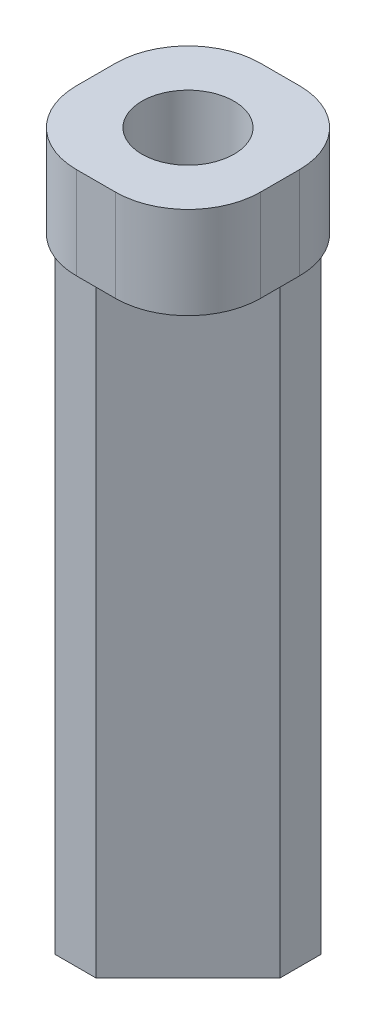
ISO-10303-21;
HEADER;
FILE_DESCRIPTION(('STEP AP214'),'2;1');
FILE_NAME('part.step','',(''),(''),'','','');
FILE_SCHEMA(('AUTOMOTIVE_DESIGN { 1 0 10303 214 1 1 1 1 }'));
ENDSEC;
DATA;
#1=APPLICATION_CONTEXT('core data for automotive mechanical design processes');
#2=APPLICATION_PROTOCOL_DEFINITION('international standard','automotive_design',2000,#1);
#3=PRODUCT_CONTEXT('',#1,'mechanical');
#4=PRODUCT('Part','Part','',(#3));
#5=PRODUCT_RELATED_PRODUCT_CATEGORY('part','',(#4));
#6=PRODUCT_DEFINITION_FORMATION('','',#4);
#7=PRODUCT_DEFINITION_CONTEXT('part definition',#1,'design');
#8=PRODUCT_DEFINITION('design','',#6,#7);
#9=PRODUCT_DEFINITION_SHAPE('','',#8);
#10=(LENGTH_UNIT() NAMED_UNIT(*) SI_UNIT(.MILLI.,.METRE.));
#11=(NAMED_UNIT(*) PLANE_ANGLE_UNIT() SI_UNIT($,.RADIAN.));
#12=(NAMED_UNIT(*) SI_UNIT($,.STERADIAN.) SOLID_ANGLE_UNIT());
#13=UNCERTAINTY_MEASURE_WITH_UNIT(LENGTH_MEASURE(1.E-05),#10,'distance_accuracy_value','');
#14=(GEOMETRIC_REPRESENTATION_CONTEXT(3) GLOBAL_UNCERTAINTY_ASSIGNED_CONTEXT((#13)) GLOBAL_UNIT_ASSIGNED_CONTEXT((#10,
#11,#12)) REPRESENTATION_CONTEXT('',''));
#15=CARTESIAN_POINT('',(0.,0.,0.));
#16=DIRECTION('',(0.,0.,1.));
#17=DIRECTION('',(1.,0.,0.));
#18=AXIS2_PLACEMENT_3D('',#15,#16,#17);
#19=CARTESIAN_POINT('',(44.45,19.05,57.15));
#20=DIRECTION('',(0.,1.,0.));
#21=DIRECTION('',(0.,0.,1.));
#22=AXIS2_PLACEMENT_3D('',#19,#20,#21);
#23=PLANE('',#22);
#24=CARTESIAN_POINT('',(-55.2794444968305,19.05,-55.2794444968305));
#25=DIRECTION('',(0.,-1.,0.));
#26=DIRECTION('',(0.,0.,-1.));
#27=AXIS2_PLACEMENT_3D('',#24,#25,#26);
#28=CIRCLE('',#27,3.81);
#29=CARTESIAN_POINT('',(-55.2794444968305,19.05,-59.0894444968305));
#30=VERTEX_POINT('',#29);
#31=EDGE_CURVE('E427',#30,#30,#28,.T.);
#32=ORIENTED_EDGE('',*,*,#31,.F.);
#33=EDGE_LOOP('',(#32));
#34=FACE_BOUND('',#33,.T.);
#35=CARTESIAN_POINT('',(-53.5,19.05,-48.1));
#36=DIRECTION('',(0.,-1.,0.));
#37=DIRECTION('',(0.,0.,-1.));
#38=AXIS2_PLACEMENT_3D('',#35,#36,#37);
#39=CIRCLE('',#38,10.);
#40=CARTESIAN_POINT('',(-62.8100751876664,19.05,-44.45));
#41=VERTEX_POINT('',#40);
#42=CARTESIAN_POINT('',(-63.5,19.05,-48.1));
#43=VERTEX_POINT('',#42);
#44=EDGE_CURVE('E242',#41,#43,#39,.T.);
#45=ORIENTED_EDGE('',*,*,#44,.T.);
#46=DIRECTION('',(0.,0.,1.));
#47=VECTOR('',#46,1.);
#48=CARTESIAN_POINT('',(-63.5,19.05,-63.5));
#49=LINE('',#48,#47);
#50=CARTESIAN_POINT('',(-63.5,19.05,-53.5));
#51=VERTEX_POINT('',#50);
#52=EDGE_CURVE('E50',#51,#43,#49,.T.);
#53=ORIENTED_EDGE('',*,*,#52,.F.);
#54=CARTESIAN_POINT('',(-53.5,19.05,-53.5));
#55=DIRECTION('',(0.,1.,0.));
#56=DIRECTION('',(0.,0.,1.));
#57=AXIS2_PLACEMENT_3D('',#54,#55,#56);
#58=CIRCLE('',#57,10.);
#59=CARTESIAN_POINT('',(-53.5,19.05,-63.5));
#60=VERTEX_POINT('',#59);
#61=EDGE_CURVE('E238',#51,#60,#58,.F.);
#62=ORIENTED_EDGE('',*,*,#61,.T.);
#63=DIRECTION('',(-1.,0.,0.));
#64=VECTOR('',#63,1.);
#65=CARTESIAN_POINT('',(63.5,19.05,-63.5));
#66=LINE('',#65,#64);
#67=CARTESIAN_POINT('',(-48.1,19.05,-63.5));
#68=VERTEX_POINT('',#67);
#69=EDGE_CURVE('E243',#68,#60,#66,.T.);
#70=ORIENTED_EDGE('',*,*,#69,.F.);
#71=CARTESIAN_POINT('',(-48.1,19.05,-53.5));
#72=DIRECTION('',(0.,-1.,0.));
#73=DIRECTION('',(0.,0.,-1.));
#74=AXIS2_PLACEMENT_3D('',#71,#72,#73);
#75=CIRCLE('',#74,10.);
#76=CARTESIAN_POINT('',(-44.45,19.05,-62.8100751876663));
#77=VERTEX_POINT('',#76);
#78=EDGE_CURVE('E70',#68,#77,#75,.T.);
#79=ORIENTED_EDGE('',*,*,#78,.T.);
#80=DIRECTION('',(0.,0.,1.));
#81=VECTOR('',#80,1.);
#82=CARTESIAN_POINT('',(-44.45,19.05,-63.5));
#83=LINE('',#82,#81);
#84=CARTESIAN_POINT('',(-44.45,19.05,-57.1500000000001));
#85=VERTEX_POINT('',#84);
#86=EDGE_CURVE('E11',#77,#85,#83,.T.);
#87=ORIENTED_EDGE('',*,*,#86,.T.);
#88=DIRECTION('',(-0.707106781186547,0.,0.707106781186548));
#89=VECTOR('',#88,1.);
#90=CARTESIAN_POINT('',(-41.275,19.05,-60.325));
#91=LINE('',#90,#89);
#92=CARTESIAN_POINT('',(-57.15,19.05,-44.45));
#93=VERTEX_POINT('',#92);
#94=EDGE_CURVE('E56',#85,#93,#91,.T.);
#95=ORIENTED_EDGE('',*,*,#94,.T.);
#96=DIRECTION('',(1.,0.,0.));
#97=VECTOR('',#96,1.);
#98=CARTESIAN_POINT('',(-63.5,19.05,-44.45));
#99=LINE('',#98,#97);
#100=EDGE_CURVE('E197',#41,#93,#99,.T.);
#101=ORIENTED_EDGE('',*,*,#100,.F.);
#102=EDGE_LOOP('',(#45,#53,#62,#70,#79,#87,#95,#101));
#103=FACE_BOUND('',#102,.T.);
#104=ADVANCED_FACE('F47',(#34,#103),#23,.F.);
#105=CARTESIAN_POINT('',(-50.8,120.65,-50.8));
#106=DIRECTION('',(0.,-1.,0.));
#107=DIRECTION('',(0.,0.,-1.));
#108=AXIS2_PLACEMENT_3D('',#105,#106,#107);
#109=CYLINDRICAL_SURFACE('',#108,6.35);
#110=CARTESIAN_POINT('',(-50.8,120.65,-50.8));
#111=DIRECTION('',(0.,1.,0.));
#112=DIRECTION('',(0.,0.,1.));
#113=AXIS2_PLACEMENT_3D('',#110,#111,#112);
#114=CIRCLE('',#113,6.35);
#115=CARTESIAN_POINT('',(-50.8,120.65,-44.45));
#116=VERTEX_POINT('',#115);
#117=EDGE_CURVE('E193',#116,#116,#114,.T.);
#118=ORIENTED_EDGE('',*,*,#117,.T.);
#119=EDGE_LOOP('',(#118));
#120=FACE_BOUND('',#119,.T.);
#121=CARTESIAN_POINT('',(-50.8,107.95,-50.8));
#122=DIRECTION('',(0.,1.,0.));
#123=DIRECTION('',(0.,0.,1.));
#124=AXIS2_PLACEMENT_3D('',#121,#122,#123);
#125=CIRCLE('',#124,6.35);
#126=CARTESIAN_POINT('',(-46.3098719394654,107.95,-55.2901280605346));
#127=VERTEX_POINT('',#126);
#128=CARTESIAN_POINT('',(-55.2901280605346,107.95,-46.3098719394654));
#129=VERTEX_POINT('',#128);
#130=EDGE_CURVE('E191',#127,#129,#125,.T.);
#131=ORIENTED_EDGE('',*,*,#130,.F.);
#132=EDGE_CURVE('E175',#129,#127,#125,.T.);
#133=ORIENTED_EDGE('',*,*,#132,.F.);
#134=EDGE_LOOP('',(#131,#133));
#135=FACE_BOUND('',#134,.T.);
#136=ADVANCED_FACE('F190',(#120,#135),#109,.F.);
#137=CARTESIAN_POINT('',(-48.1,120.65,-48.1));
#138=DIRECTION('',(0.,-1.,0.));
#139=DIRECTION('',(0.,0.,-1.));
#140=AXIS2_PLACEMENT_3D('',#137,#138,#139);
#141=CYLINDRICAL_SURFACE('',#140,10.);
#142=CARTESIAN_POINT('',(-48.1,120.65,-48.1));
#143=DIRECTION('',(0.,-1.,0.));
#144=DIRECTION('',(0.,0.,-1.));
#145=AXIS2_PLACEMENT_3D('',#142,#143,#144);
#146=CIRCLE('',#145,10.);
#147=CARTESIAN_POINT('',(-48.1,120.65,-38.0999999999999));
#148=VERTEX_POINT('',#147);
#149=CARTESIAN_POINT('',(-38.1,120.65,-48.1));
#150=VERTEX_POINT('',#149);
#151=EDGE_CURVE('E294',#148,#150,#146,.F.);
#152=ORIENTED_EDGE('',*,*,#151,.F.);
#153=DIRECTION('',(0.,-1.,0.));
#154=VECTOR('',#153,1.);
#155=CARTESIAN_POINT('',(-48.1,120.65,-38.0999999999999));
#156=LINE('',#155,#154);
#157=CARTESIAN_POINT('',(-48.1,107.95,-38.0999999999999));
#158=VERTEX_POINT('',#157);
#159=EDGE_CURVE('E253',#158,#148,#156,.F.);
#160=ORIENTED_EDGE('',*,*,#159,.F.);
#161=CARTESIAN_POINT('',(-48.1,107.95,-48.1));
#162=DIRECTION('',(0.,-1.,0.));
#163=DIRECTION('',(0.,0.,-1.));
#164=AXIS2_PLACEMENT_3D('',#161,#162,#163);
#165=CIRCLE('',#164,10.);
#166=CARTESIAN_POINT('',(-38.1,107.95,-48.1));
#167=VERTEX_POINT('',#166);
#168=EDGE_CURVE('E278',#167,#158,#165,.T.);
#169=ORIENTED_EDGE('',*,*,#168,.F.);
#170=DIRECTION('',(0.,-1.,0.));
#171=VECTOR('',#170,1.);
#172=CARTESIAN_POINT('',(-38.1,120.65,-48.1));
#173=LINE('',#172,#171);
#174=EDGE_CURVE('E284',#150,#167,#173,.T.);
#175=ORIENTED_EDGE('',*,*,#174,.F.);
#176=EDGE_LOOP('',(#152,#160,#169,#175));
#177=FACE_BOUND('',#176,.T.);
#178=ADVANCED_FACE('F343',(#177),#141,.T.);
#179=CARTESIAN_POINT('',(-53.5,107.95,-53.5));
#180=DIRECTION('',(0.,-1.,0.));
#181=DIRECTION('',(0.,0.,-1.));
#182=AXIS2_PLACEMENT_3D('',#179,#180,#181);
#183=CYLINDRICAL_SURFACE('',#182,10.);
#184=CARTESIAN_POINT('',(-53.5,120.65,-53.5));
#185=DIRECTION('',(0.,-1.,0.));
#186=DIRECTION('',(0.,0.,-1.));
#187=AXIS2_PLACEMENT_3D('',#184,#185,#186);
#188=CIRCLE('',#187,10.);
#189=CARTESIAN_POINT('',(-53.5,120.65,-63.4999999999999));
#190=VERTEX_POINT('',#189);
#191=CARTESIAN_POINT('',(-63.5,120.65,-53.5));
#192=VERTEX_POINT('',#191);
#193=EDGE_CURVE('E297',#190,#192,#188,.F.);
#194=ORIENTED_EDGE('',*,*,#193,.F.);
#195=DIRECTION('',(0.,-1.,0.));
#196=VECTOR('',#195,1.);
#197=CARTESIAN_POINT('',(-53.5,107.95,-63.5));
#198=LINE('',#197,#196);
#199=CARTESIAN_POINT('',(-53.5,107.95,-63.5));
#200=VERTEX_POINT('',#199);
#201=EDGE_CURVE('E168',#200,#190,#198,.F.);
#202=ORIENTED_EDGE('',*,*,#201,.F.);
#203=CARTESIAN_POINT('',(-53.5,107.95,-53.5));
#204=DIRECTION('',(0.,1.,0.));
#205=DIRECTION('',(0.,0.,1.));
#206=AXIS2_PLACEMENT_3D('',#203,#204,#205);
#207=CIRCLE('',#206,10.);
#208=CARTESIAN_POINT('',(-63.5,107.95,-53.5));
#209=VERTEX_POINT('',#208);
#210=EDGE_CURVE('E184',#200,#209,#207,.T.);
#211=ORIENTED_EDGE('',*,*,#210,.T.);
#212=DIRECTION('',(0.,-1.,0.));
#213=VECTOR('',#212,1.);
#214=CARTESIAN_POINT('',(-63.5,107.95,-53.5));
#215=LINE('',#214,#213);
#216=EDGE_CURVE('E223',#192,#209,#215,.T.);
#217=ORIENTED_EDGE('',*,*,#216,.F.);
#218=EDGE_LOOP('',(#194,#202,#211,#217));
#219=FACE_BOUND('',#218,.T.);
#220=ADVANCED_FACE('F222',(#219),#183,.T.);
#221=CARTESIAN_POINT('',(0.,107.95,0.));
#222=DIRECTION('',(0.,1.,0.));
#223=DIRECTION('',(0.,0.,1.));
#224=AXIS2_PLACEMENT_3D('',#221,#222,#223);
#225=PLANE('',#224);
#226=ORIENTED_EDGE('',*,*,#130,.T.);
#227=DIRECTION('',(0.707106781186547,0.,-0.707106781186548));
#228=VECTOR('',#227,1.);
#229=CARTESIAN_POINT('',(-50.8000000000001,107.95,-50.8));
#230=LINE('',#229,#228);
#231=EDGE_CURVE('E178',#129,#127,#230,.T.);
#232=ORIENTED_EDGE('',*,*,#231,.T.);
#233=EDGE_LOOP('',(#226,#232));
#234=FACE_BOUND('',#233,.T.);
#235=ADVANCED_FACE('F352',(#234),#225,.T.);
#236=CARTESIAN_POINT('',(63.5,107.95,-63.5));
#237=DIRECTION('',(0.,0.,1.));
#238=DIRECTION('',(1.,0.,0.));
#239=AXIS2_PLACEMENT_3D('',#236,#237,#238);
#240=PLANE('',#239);
#241=DIRECTION('',(0.,-1.,0.));
#242=VECTOR('',#241,1.);
#243=CARTESIAN_POINT('',(-48.1,107.95,-63.5));
#244=LINE('',#243,#242);
#245=CARTESIAN_POINT('',(-48.1,120.65,-63.4999999999999));
#246=VERTEX_POINT('',#245);
#247=EDGE_CURVE('E269',#246,#68,#244,.T.);
#248=ORIENTED_EDGE('',*,*,#247,.T.);
#249=ORIENTED_EDGE('',*,*,#69,.T.);
#250=DIRECTION('',(0.,-1.,0.));
#251=VECTOR('',#250,1.);
#252=CARTESIAN_POINT('',(-53.5,107.95,-63.5));
#253=LINE('',#252,#251);
#254=EDGE_CURVE('E160',#60,#200,#253,.F.);
#255=ORIENTED_EDGE('',*,*,#254,.T.);
#256=ORIENTED_EDGE('',*,*,#201,.T.);
#257=DIRECTION('',(-1.,0.,0.));
#258=VECTOR('',#257,1.);
#259=CARTESIAN_POINT('',(-38.1,120.65,-63.4999999999999));
#260=LINE('',#259,#258);
#261=EDGE_CURVE('E327',#246,#190,#260,.T.);
#262=ORIENTED_EDGE('',*,*,#261,.F.);
#263=EDGE_LOOP('',(#248,#249,#255,#256,#262));
#264=FACE_BOUND('',#263,.T.);
#265=ADVANCED_FACE('F350',(#264),#240,.F.);
#266=CARTESIAN_POINT('',(-44.45,19.05,-63.5));
#267=DIRECTION('',(1.,0.,0.));
#268=DIRECTION('',(0.,0.,-1.));
#269=AXIS2_PLACEMENT_3D('',#266,#267,#268);
#270=PLANE('',#269);
#271=ORIENTED_EDGE('',*,*,#86,.F.);
#272=DIRECTION('',(0.,-1.,0.));
#273=VECTOR('',#272,1.);
#274=CARTESIAN_POINT('',(-44.45,19.05,-62.8100751876663));
#275=LINE('',#274,#273);
#276=CARTESIAN_POINT('',(-44.45,107.95,-62.8100751876663));
#277=VERTEX_POINT('',#276);
#278=EDGE_CURVE('E155',#77,#277,#275,.F.);
#279=ORIENTED_EDGE('',*,*,#278,.T.);
#280=DIRECTION('',(0.,0.,1.));
#281=VECTOR('',#280,1.);
#282=CARTESIAN_POINT('',(-44.45,107.95,-63.5));
#283=LINE('',#282,#281);
#284=CARTESIAN_POINT('',(-44.45,107.95,-57.1500000000001));
#285=VERTEX_POINT('',#284);
#286=EDGE_CURVE('E152',#277,#285,#283,.T.);
#287=ORIENTED_EDGE('',*,*,#286,.T.);
#288=DIRECTION('',(0.,-1.,0.));
#289=VECTOR('',#288,1.);
#290=CARTESIAN_POINT('',(-44.45,19.05,-57.1500000000001));
#291=LINE('',#290,#289);
#292=EDGE_CURVE('E154',#285,#85,#291,.T.);
#293=ORIENTED_EDGE('',*,*,#292,.T.);
#294=EDGE_LOOP('',(#271,#279,#287,#293));
#295=FACE_BOUND('',#294,.T.);
#296=ADVANCED_FACE('F153',(#295),#270,.T.);
#297=CARTESIAN_POINT('',(-38.1,120.65,-38.0999999999999));
#298=DIRECTION('',(-1.,0.,0.));
#299=DIRECTION('',(0.,0.,1.));
#300=AXIS2_PLACEMENT_3D('',#297,#298,#299);
#301=PLANE('',#300);
#302=DIRECTION('',(0.,0.,-1.));
#303=VECTOR('',#302,1.);
#304=CARTESIAN_POINT('',(-38.1,107.95,-38.0999999999999));
#305=LINE('',#304,#303);
#306=CARTESIAN_POINT('',(-38.1,107.95,-53.5));
#307=VERTEX_POINT('',#306);
#308=EDGE_CURVE('E318',#167,#307,#305,.T.);
#309=ORIENTED_EDGE('',*,*,#308,.T.);
#310=DIRECTION('',(0.,-1.,0.));
#311=VECTOR('',#310,1.);
#312=CARTESIAN_POINT('',(-38.1,120.65,-53.5));
#313=LINE('',#312,#311);
#314=CARTESIAN_POINT('',(-38.1,120.65,-53.5));
#315=VERTEX_POINT('',#314);
#316=EDGE_CURVE('E288',#307,#315,#313,.F.);
#317=ORIENTED_EDGE('',*,*,#316,.T.);
#318=DIRECTION('',(0.,0.,-1.));
#319=VECTOR('',#318,1.);
#320=CARTESIAN_POINT('',(-38.1,120.65,-38.0999999999999));
#321=LINE('',#320,#319);
#322=EDGE_CURVE('E331',#150,#315,#321,.T.);
#323=ORIENTED_EDGE('',*,*,#322,.F.);
#324=ORIENTED_EDGE('',*,*,#174,.T.);
#325=EDGE_LOOP('',(#309,#317,#323,#324));
#326=FACE_BOUND('',#325,.T.);
#327=ADVANCED_FACE('F345',(#326),#301,.F.);
#328=CARTESIAN_POINT('',(-38.1,120.65,-38.0999999999999));
#329=DIRECTION('',(0.,0.,-1.));
#330=DIRECTION('',(-1.,0.,0.));
#331=AXIS2_PLACEMENT_3D('',#328,#329,#330);
#332=PLANE('',#331);
#333=DIRECTION('',(1.,0.,0.));
#334=VECTOR('',#333,1.);
#335=CARTESIAN_POINT('',(-38.1,107.95,-38.0999999999999));
#336=LINE('',#335,#334);
#337=CARTESIAN_POINT('',(-53.5,107.95,-38.0999999999999));
#338=VERTEX_POINT('',#337);
#339=EDGE_CURVE('E199',#338,#158,#336,.T.);
#340=ORIENTED_EDGE('',*,*,#339,.T.);
#341=ORIENTED_EDGE('',*,*,#159,.T.);
#342=DIRECTION('',(1.,0.,0.));
#343=VECTOR('',#342,1.);
#344=CARTESIAN_POINT('',(-38.1,120.65,-38.0999999999999));
#345=LINE('',#344,#343);
#346=CARTESIAN_POINT('',(-53.5,120.65,-38.0999999999999));
#347=VERTEX_POINT('',#346);
#348=EDGE_CURVE('E202',#347,#148,#345,.T.);
#349=ORIENTED_EDGE('',*,*,#348,.F.);
#350=DIRECTION('',(0.,-1.,0.));
#351=VECTOR('',#350,1.);
#352=CARTESIAN_POINT('',(-53.5,120.65,-38.0999999999999));
#353=LINE('',#352,#351);
#354=EDGE_CURVE('E233',#347,#338,#353,.T.);
#355=ORIENTED_EDGE('',*,*,#354,.T.);
#356=EDGE_LOOP('',(#340,#341,#349,#355));
#357=FACE_BOUND('',#356,.T.);
#358=ADVANCED_FACE('F311',(#357),#332,.F.);
#359=CARTESIAN_POINT('',(0.,107.95,0.));
#360=DIRECTION('',(0.,-1.,0.));
#361=DIRECTION('',(0.,0.,-1.));
#362=AXIS2_PLACEMENT_3D('',#359,#360,#361);
#363=PLANE('',#362);
#364=ORIENTED_EDGE('',*,*,#286,.F.);
#365=CARTESIAN_POINT('',(-48.1,107.95,-53.5));
#366=DIRECTION('',(0.,-1.,0.));
#367=DIRECTION('',(0.,0.,-1.));
#368=AXIS2_PLACEMENT_3D('',#365,#366,#367);
#369=CIRCLE('',#368,10.);
#370=EDGE_CURVE('E281',#277,#307,#369,.T.);
#371=ORIENTED_EDGE('',*,*,#370,.T.);
#372=ORIENTED_EDGE('',*,*,#308,.F.);
#373=ORIENTED_EDGE('',*,*,#168,.T.);
#374=ORIENTED_EDGE('',*,*,#339,.F.);
#375=CARTESIAN_POINT('',(-53.5,107.95,-48.1));
#376=DIRECTION('',(0.,-1.,0.));
#377=DIRECTION('',(0.,0.,-1.));
#378=AXIS2_PLACEMENT_3D('',#375,#376,#377);
#379=CIRCLE('',#378,10.);
#380=CARTESIAN_POINT('',(-62.8100751876664,107.95,-44.45));
#381=VERTEX_POINT('',#380);
#382=EDGE_CURVE('E275',#338,#381,#379,.T.);
#383=ORIENTED_EDGE('',*,*,#382,.T.);
#384=DIRECTION('',(1.,0.,0.));
#385=VECTOR('',#384,1.);
#386=CARTESIAN_POINT('',(-63.5,107.95,-44.45));
#387=LINE('',#386,#385);
#388=CARTESIAN_POINT('',(-57.15,107.95,-44.45));
#389=VERTEX_POINT('',#388);
#390=EDGE_CURVE('E161',#381,#389,#387,.T.);
#391=ORIENTED_EDGE('',*,*,#390,.T.);
#392=EDGE_CURVE('E169',#389,#129,#230,.T.);
#393=ORIENTED_EDGE('',*,*,#392,.T.);
#394=ORIENTED_EDGE('',*,*,#132,.T.);
#395=EDGE_CURVE('E165',#127,#285,#230,.T.);
#396=ORIENTED_EDGE('',*,*,#395,.T.);
#397=EDGE_LOOP('',(#364,#371,#372,#373,#374,#383,#391,#393,#394,#396));
#398=FACE_BOUND('',#397,.T.);
#399=ADVANCED_FACE('F172',(#398),#363,.T.);
#400=CARTESIAN_POINT('',(-63.5,19.05,-44.45));
#401=DIRECTION('',(0.,0.,-1.));
#402=DIRECTION('',(-1.,0.,0.));
#403=AXIS2_PLACEMENT_3D('',#400,#401,#402);
#404=PLANE('',#403);
#405=ORIENTED_EDGE('',*,*,#390,.F.);
#406=DIRECTION('',(0.,-1.,0.));
#407=VECTOR('',#406,1.);
#408=CARTESIAN_POINT('',(-62.8100751876664,107.95,-44.45));
#409=LINE('',#408,#407);
#410=EDGE_CURVE('E248',#381,#41,#409,.T.);
#411=ORIENTED_EDGE('',*,*,#410,.T.);
#412=ORIENTED_EDGE('',*,*,#100,.T.);
#413=DIRECTION('',(0.,1.,0.));
#414=VECTOR('',#413,1.);
#415=CARTESIAN_POINT('',(-57.15,107.95,-44.45));
#416=LINE('',#415,#414);
#417=EDGE_CURVE('E179',#93,#389,#416,.T.);
#418=ORIENTED_EDGE('',*,*,#417,.T.);
#419=EDGE_LOOP('',(#405,#411,#412,#418));
#420=FACE_BOUND('',#419,.T.);
#421=ADVANCED_FACE('F402',(#420),#404,.F.);
#422=CARTESIAN_POINT('',(-63.5,107.95,-63.5));
#423=DIRECTION('',(1.,0.,0.));
#424=DIRECTION('',(0.,0.,-1.));
#425=AXIS2_PLACEMENT_3D('',#422,#423,#424);
#426=PLANE('',#425);
#427=DIRECTION('',(0.,-1.,0.));
#428=VECTOR('',#427,1.);
#429=CARTESIAN_POINT('',(-63.5,107.95,-53.5));
#430=LINE('',#429,#428);
#431=EDGE_CURVE('E211',#209,#51,#430,.T.);
#432=ORIENTED_EDGE('',*,*,#431,.T.);
#433=ORIENTED_EDGE('',*,*,#52,.T.);
#434=DIRECTION('',(0.,-1.,0.));
#435=VECTOR('',#434,1.);
#436=CARTESIAN_POINT('',(-63.5,107.95,-48.1));
#437=LINE('',#436,#435);
#438=CARTESIAN_POINT('',(-63.5,120.65,-48.1));
#439=VERTEX_POINT('',#438);
#440=EDGE_CURVE('E234',#43,#439,#437,.F.);
#441=ORIENTED_EDGE('',*,*,#440,.T.);
#442=DIRECTION('',(0.,0.,1.));
#443=VECTOR('',#442,1.);
#444=CARTESIAN_POINT('',(-63.5,120.65,-38.0999999999999));
#445=LINE('',#444,#443);
#446=EDGE_CURVE('E231',#192,#439,#445,.T.);
#447=ORIENTED_EDGE('',*,*,#446,.F.);
#448=ORIENTED_EDGE('',*,*,#216,.T.);
#449=EDGE_LOOP('',(#432,#433,#441,#447,#448));
#450=FACE_BOUND('',#449,.T.);
#451=ADVANCED_FACE('F229',(#450),#426,.F.);
#452=CARTESIAN_POINT('',(0.,120.65,0.));
#453=DIRECTION('',(0.,-1.,0.));
#454=DIRECTION('',(0.,0.,-1.));
#455=AXIS2_PLACEMENT_3D('',#452,#453,#454);
#456=PLANE('',#455);
#457=ORIENTED_EDGE('',*,*,#322,.T.);
#458=CARTESIAN_POINT('',(-48.1,120.65,-53.5));
#459=DIRECTION('',(0.,-1.,0.));
#460=DIRECTION('',(0.,0.,-1.));
#461=AXIS2_PLACEMENT_3D('',#458,#459,#460);
#462=CIRCLE('',#461,10.);
#463=EDGE_CURVE('E300',#315,#246,#462,.F.);
#464=ORIENTED_EDGE('',*,*,#463,.T.);
#465=ORIENTED_EDGE('',*,*,#261,.T.);
#466=ORIENTED_EDGE('',*,*,#193,.T.);
#467=ORIENTED_EDGE('',*,*,#446,.T.);
#468=CARTESIAN_POINT('',(-53.5,120.65,-48.1));
#469=DIRECTION('',(0.,-1.,0.));
#470=DIRECTION('',(0.,0.,-1.));
#471=AXIS2_PLACEMENT_3D('',#468,#469,#470);
#472=CIRCLE('',#471,10.);
#473=EDGE_CURVE('E291',#439,#347,#472,.F.);
#474=ORIENTED_EDGE('',*,*,#473,.T.);
#475=ORIENTED_EDGE('',*,*,#348,.T.);
#476=ORIENTED_EDGE('',*,*,#151,.T.);
#477=EDGE_LOOP('',(#457,#464,#465,#466,#467,#474,#475,#476));
#478=FACE_BOUND('',#477,.T.);
#479=ORIENTED_EDGE('',*,*,#117,.F.);
#480=EDGE_LOOP('',(#479));
#481=FACE_BOUND('',#480,.T.);
#482=ADVANCED_FACE('F339',(#478,#481),#456,.F.);
#483=CARTESIAN_POINT('',(-53.5,120.65,-48.1));
#484=DIRECTION('',(0.,-1.,0.));
#485=DIRECTION('',(0.,0.,-1.));
#486=AXIS2_PLACEMENT_3D('',#483,#484,#485);
#487=CYLINDRICAL_SURFACE('',#486,10.);
#488=ORIENTED_EDGE('',*,*,#473,.F.);
#489=ORIENTED_EDGE('',*,*,#440,.F.);
#490=ORIENTED_EDGE('',*,*,#44,.F.);
#491=ORIENTED_EDGE('',*,*,#410,.F.);
#492=ORIENTED_EDGE('',*,*,#382,.F.);
#493=ORIENTED_EDGE('',*,*,#354,.F.);
#494=EDGE_LOOP('',(#488,#489,#490,#491,#492,#493));
#495=FACE_BOUND('',#494,.T.);
#496=ADVANCED_FACE('F388',(#495),#487,.T.);
#497=CARTESIAN_POINT('',(-48.1,107.95,-53.5));
#498=DIRECTION('',(0.,-1.,0.));
#499=DIRECTION('',(0.,0.,-1.));
#500=AXIS2_PLACEMENT_3D('',#497,#498,#499);
#501=CYLINDRICAL_SURFACE('',#500,10.);
#502=ORIENTED_EDGE('',*,*,#463,.F.);
#503=ORIENTED_EDGE('',*,*,#316,.F.);
#504=ORIENTED_EDGE('',*,*,#370,.F.);
#505=ORIENTED_EDGE('',*,*,#278,.F.);
#506=ORIENTED_EDGE('',*,*,#78,.F.);
#507=ORIENTED_EDGE('',*,*,#247,.F.);
#508=EDGE_LOOP('',(#502,#503,#504,#505,#506,#507));
#509=FACE_BOUND('',#508,.T.);
#510=ADVANCED_FACE('F347',(#509),#501,.T.);
#511=CARTESIAN_POINT('',(-57.15,19.05,-44.45));
#512=DIRECTION('',(0.707106781186548,0.,0.707106781186547));
#513=DIRECTION('',(0.,-1.,0.));
#514=AXIS2_PLACEMENT_3D('',#511,#512,#513);
#515=PLANE('',#514);
#516=ORIENTED_EDGE('',*,*,#94,.F.);
#517=ORIENTED_EDGE('',*,*,#292,.F.);
#518=ORIENTED_EDGE('',*,*,#395,.F.);
#519=ORIENTED_EDGE('',*,*,#231,.F.);
#520=ORIENTED_EDGE('',*,*,#392,.F.);
#521=ORIENTED_EDGE('',*,*,#417,.F.);
#522=EDGE_LOOP('',(#516,#517,#518,#519,#520,#521));
#523=FACE_BOUND('',#522,.T.);
#524=ADVANCED_FACE('F163',(#523),#515,.T.);
#525=CARTESIAN_POINT('',(-53.5,107.95,-53.5));
#526=DIRECTION('',(0.,-1.,0.));
#527=DIRECTION('',(0.,0.,-1.));
#528=AXIS2_PLACEMENT_3D('',#525,#526,#527);
#529=CYLINDRICAL_SURFACE('',#528,10.);
#530=ORIENTED_EDGE('',*,*,#61,.F.);
#531=ORIENTED_EDGE('',*,*,#431,.F.);
#532=ORIENTED_EDGE('',*,*,#210,.F.);
#533=ORIENTED_EDGE('',*,*,#254,.F.);
#534=EDGE_LOOP('',(#530,#531,#532,#533));
#535=FACE_BOUND('',#534,.T.);
#536=ADVANCED_FACE('F236',(#535),#529,.T.);
#537=CARTESIAN_POINT('',(-55.2794444968305,31.75,-55.2794444968305));
#538=DIRECTION('',(0.,-1.,0.));
#539=DIRECTION('',(0.,0.,-1.));
#540=AXIS2_PLACEMENT_3D('',#537,#538,#539);
#541=CYLINDRICAL_SURFACE('',#540,3.81);
#542=CARTESIAN_POINT('',(-55.2794444968305,31.75,-55.2794444968305));
#543=DIRECTION('',(0.,-1.,0.));
#544=DIRECTION('',(0.,0.,-1.));
#545=AXIS2_PLACEMENT_3D('',#542,#543,#544);
#546=CIRCLE('',#545,3.81);
#547=CARTESIAN_POINT('',(-55.2794444968305,31.75,-59.0894444968305));
#548=VERTEX_POINT('',#547);
#549=EDGE_CURVE('E328',#548,#548,#546,.T.);
#550=ORIENTED_EDGE('',*,*,#549,.F.);
#551=EDGE_LOOP('',(#550));
#552=FACE_BOUND('',#551,.T.);
#553=ORIENTED_EDGE('',*,*,#31,.T.);
#554=EDGE_LOOP('',(#553));
#555=FACE_BOUND('',#554,.T.);
#556=ADVANCED_FACE('F372',(#552,#555),#541,.F.);
#557=CARTESIAN_POINT('',(-55.2794444968305,31.75,-55.2794444968305));
#558=DIRECTION('',(0.,-1.,0.));
#559=DIRECTION('',(0.,0.,-1.));
#560=AXIS2_PLACEMENT_3D('',#557,#558,#559);
#561=PLANE('',#560);
#562=ORIENTED_EDGE('',*,*,#549,.T.);
#563=EDGE_LOOP('',(#562));
#564=FACE_BOUND('',#563,.T.);
#565=ADVANCED_FACE('F378',(#564),#561,.T.);
#566=CLOSED_SHELL('',(#104,#136,#178,#220,#235,#265,#296,#327,#358,#399,#421,#451,#482,#496,
#510,#524,#536,#556,#565));
#567=MANIFOLD_SOLID_BREP('B2',#566);
#568=ADVANCED_BREP_SHAPE_REPRESENTATION('',(#18,#567),#14);
#569=SHAPE_DEFINITION_REPRESENTATION(#9,#568);
ENDSEC;
END-ISO-10303-21;
